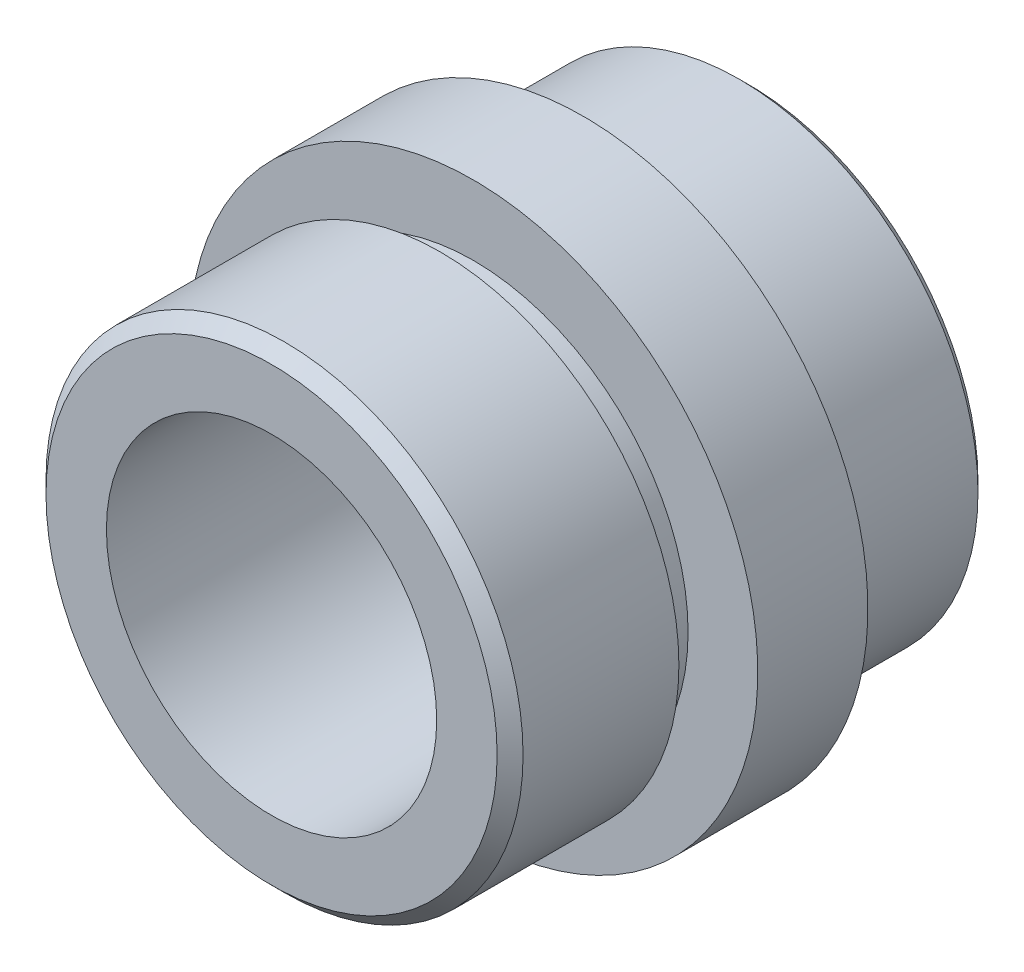
ISO-10303-21;
HEADER;
FILE_DESCRIPTION(('STEP AP214'),'2;1');
FILE_NAME('part.step','',(''),(''),'','','');
FILE_SCHEMA(('AUTOMOTIVE_DESIGN { 1 0 10303 214 1 1 1 1 }'));
ENDSEC;
DATA;
#1=APPLICATION_CONTEXT('core data for automotive mechanical design processes');
#2=APPLICATION_PROTOCOL_DEFINITION('international standard','automotive_design',2000,#1);
#3=PRODUCT_CONTEXT('',#1,'mechanical');
#4=PRODUCT('Part','Part','',(#3));
#5=PRODUCT_RELATED_PRODUCT_CATEGORY('part','',(#4));
#6=PRODUCT_DEFINITION_FORMATION('','',#4);
#7=PRODUCT_DEFINITION_CONTEXT('part definition',#1,'design');
#8=PRODUCT_DEFINITION('design','',#6,#7);
#9=PRODUCT_DEFINITION_SHAPE('','',#8);
#10=(LENGTH_UNIT() NAMED_UNIT(*) SI_UNIT(.MILLI.,.METRE.));
#11=(NAMED_UNIT(*) PLANE_ANGLE_UNIT() SI_UNIT($,.RADIAN.));
#12=(NAMED_UNIT(*) SI_UNIT($,.STERADIAN.) SOLID_ANGLE_UNIT());
#13=UNCERTAINTY_MEASURE_WITH_UNIT(LENGTH_MEASURE(1.E-05),#10,'distance_accuracy_value','');
#14=(GEOMETRIC_REPRESENTATION_CONTEXT(3) GLOBAL_UNCERTAINTY_ASSIGNED_CONTEXT((#13)) GLOBAL_UNIT_ASSIGNED_CONTEXT((#10,
#11,#12)) REPRESENTATION_CONTEXT('',''));
#15=CARTESIAN_POINT('',(0.,0.,0.));
#16=DIRECTION('',(0.,0.,1.));
#17=DIRECTION('',(1.,0.,0.));
#18=AXIS2_PLACEMENT_3D('',#15,#16,#17);
#19=CARTESIAN_POINT('',(0.,0.,26.005));
#20=DIRECTION('',(0.,0.,-1.));
#21=DIRECTION('',(-1.,0.,0.));
#22=AXIS2_PLACEMENT_3D('',#19,#20,#21);
#23=CYLINDRICAL_SURFACE('',#22,11.7);
#24=CARTESIAN_POINT('',(0.,0.,16.8));
#25=DIRECTION('',(0.,0.,-1.));
#26=DIRECTION('',(-1.,0.,0.));
#27=AXIS2_PLACEMENT_3D('',#24,#25,#26);
#28=CIRCLE('',#27,11.7);
#29=CARTESIAN_POINT('',(-11.7,0.,16.8));
#30=VERTEX_POINT('',#29);
#31=EDGE_CURVE('E84',#30,#30,#28,.T.);
#32=ORIENTED_EDGE('',*,*,#31,.T.);
#33=EDGE_LOOP('',(#32));
#34=FACE_BOUND('',#33,.T.);
#35=CARTESIAN_POINT('',(0.,0.,15.));
#36=DIRECTION('',(0.,0.,-1.));
#37=DIRECTION('',(-1.,0.,0.));
#38=AXIS2_PLACEMENT_3D('',#35,#36,#37);
#39=CIRCLE('',#38,11.7);
#40=CARTESIAN_POINT('',(-11.7,0.,15.));
#41=VERTEX_POINT('',#40);
#42=EDGE_CURVE('E10',#41,#41,#39,.T.);
#43=ORIENTED_EDGE('',*,*,#42,.F.);
#44=EDGE_LOOP('',(#43));
#45=FACE_BOUND('',#44,.T.);
#46=ADVANCED_FACE('F35',(#34,#45),#23,.T.);
#47=CARTESIAN_POINT('',(15.5,0.,15.));
#48=DIRECTION('',(0.,0.,1.));
#49=DIRECTION('',(1.,0.,0.));
#50=AXIS2_PLACEMENT_3D('',#47,#48,#49);
#51=PLANE('',#50);
#52=ORIENTED_EDGE('',*,*,#42,.T.);
#53=EDGE_LOOP('',(#52));
#54=FACE_BOUND('',#53,.T.);
#55=CARTESIAN_POINT('',(0.,0.,15.));
#56=DIRECTION('',(0.,0.,-1.));
#57=DIRECTION('',(-1.,0.,0.));
#58=AXIS2_PLACEMENT_3D('',#55,#56,#57);
#59=CIRCLE('',#58,15.5);
#60=CARTESIAN_POINT('',(-15.5,0.,15.));
#61=VERTEX_POINT('',#60);
#62=EDGE_CURVE('E41',#61,#61,#59,.T.);
#63=ORIENTED_EDGE('',*,*,#62,.F.);
#64=EDGE_LOOP('',(#63));
#65=FACE_BOUND('',#64,.T.);
#66=ADVANCED_FACE('F102',(#54,#65),#51,.T.);
#67=CARTESIAN_POINT('',(0.,0.,26.005));
#68=DIRECTION('',(0.,0.,-1.));
#69=DIRECTION('',(-1.,0.,0.));
#70=AXIS2_PLACEMENT_3D('',#67,#68,#69);
#71=CYLINDRICAL_SURFACE('',#70,15.5);
#72=ORIENTED_EDGE('',*,*,#62,.T.);
#73=EDGE_LOOP('',(#72));
#74=FACE_BOUND('',#73,.T.);
#75=CARTESIAN_POINT('',(0.,0.,9.));
#76=DIRECTION('',(0.,0.,-1.));
#77=DIRECTION('',(-1.,0.,0.));
#78=AXIS2_PLACEMENT_3D('',#75,#76,#77);
#79=CIRCLE('',#78,15.5);
#80=CARTESIAN_POINT('',(-15.5,0.,9.));
#81=VERTEX_POINT('',#80);
#82=EDGE_CURVE('E45',#81,#81,#79,.T.);
#83=ORIENTED_EDGE('',*,*,#82,.F.);
#84=EDGE_LOOP('',(#83));
#85=FACE_BOUND('',#84,.T.);
#86=ADVANCED_FACE('F106',(#74,#85),#71,.T.);
#87=CARTESIAN_POINT('',(11.7,0.,9.));
#88=DIRECTION('',(0.,0.,-1.));
#89=DIRECTION('',(-1.,0.,0.));
#90=AXIS2_PLACEMENT_3D('',#87,#88,#89);
#91=PLANE('',#90);
#92=ORIENTED_EDGE('',*,*,#82,.T.);
#93=EDGE_LOOP('',(#92));
#94=FACE_BOUND('',#93,.T.);
#95=CARTESIAN_POINT('',(0.,0.,9.));
#96=DIRECTION('',(0.,0.,-1.));
#97=DIRECTION('',(-1.,0.,0.));
#98=AXIS2_PLACEMENT_3D('',#95,#96,#97);
#99=CIRCLE('',#98,11.7);
#100=CARTESIAN_POINT('',(-11.7,0.,9.));
#101=VERTEX_POINT('',#100);
#102=EDGE_CURVE('E49',#101,#101,#99,.T.);
#103=ORIENTED_EDGE('',*,*,#102,.F.);
#104=EDGE_LOOP('',(#103));
#105=FACE_BOUND('',#104,.T.);
#106=ADVANCED_FACE('F110',(#94,#105),#91,.T.);
#107=CARTESIAN_POINT('',(0.,0.,26.005));
#108=DIRECTION('',(0.,0.,-1.));
#109=DIRECTION('',(-1.,0.,0.));
#110=AXIS2_PLACEMENT_3D('',#107,#108,#109);
#111=CYLINDRICAL_SURFACE('',#110,11.7);
#112=ORIENTED_EDGE('',*,*,#102,.T.);
#113=EDGE_LOOP('',(#112));
#114=FACE_BOUND('',#113,.T.);
#115=CARTESIAN_POINT('',(0.,0.,7.7));
#116=DIRECTION('',(0.,0.,-1.));
#117=DIRECTION('',(-1.,0.,0.));
#118=AXIS2_PLACEMENT_3D('',#115,#116,#117);
#119=CIRCLE('',#118,11.7);
#120=CARTESIAN_POINT('',(-11.7,0.,7.7));
#121=VERTEX_POINT('',#120);
#122=EDGE_CURVE('E54',#121,#121,#119,.T.);
#123=ORIENTED_EDGE('',*,*,#122,.F.);
#124=EDGE_LOOP('',(#123));
#125=FACE_BOUND('',#124,.T.);
#126=ADVANCED_FACE('F116',(#114,#125),#111,.T.);
#127=CARTESIAN_POINT('',(13.,0.,7.7));
#128=DIRECTION('',(0.,0.,1.));
#129=DIRECTION('',(1.,0.,0.));
#130=AXIS2_PLACEMENT_3D('',#127,#128,#129);
#131=PLANE('',#130);
#132=ORIENTED_EDGE('',*,*,#122,.T.);
#133=EDGE_LOOP('',(#132));
#134=FACE_BOUND('',#133,.T.);
#135=CARTESIAN_POINT('',(0.,0.,7.7));
#136=DIRECTION('',(0.,0.,-1.));
#137=DIRECTION('',(-1.,0.,0.));
#138=AXIS2_PLACEMENT_3D('',#135,#136,#137);
#139=CIRCLE('',#138,13.);
#140=CARTESIAN_POINT('',(-13.,0.,7.7));
#141=VERTEX_POINT('',#140);
#142=EDGE_CURVE('E57',#141,#141,#139,.T.);
#143=ORIENTED_EDGE('',*,*,#142,.F.);
#144=EDGE_LOOP('',(#143));
#145=FACE_BOUND('',#144,.T.);
#146=ADVANCED_FACE('F120',(#134,#145),#131,.T.);
#147=CARTESIAN_POINT('',(0.,0.,26.005));
#148=DIRECTION('',(0.,0.,-1.));
#149=DIRECTION('',(-1.,0.,0.));
#150=AXIS2_PLACEMENT_3D('',#147,#148,#149);
#151=CYLINDRICAL_SURFACE('',#150,13.);
#152=ORIENTED_EDGE('',*,*,#142,.T.);
#153=EDGE_LOOP('',(#152));
#154=FACE_BOUND('',#153,.T.);
#155=CARTESIAN_POINT('',(0.,0.,0.500000000000004));
#156=DIRECTION('',(0.,0.,-1.));
#157=DIRECTION('',(-1.,0.,0.));
#158=AXIS2_PLACEMENT_3D('',#155,#156,#157);
#159=CIRCLE('',#158,13.);
#160=CARTESIAN_POINT('',(-13.,0.,0.500000000000004));
#161=VERTEX_POINT('',#160);
#162=EDGE_CURVE('E60',#161,#161,#159,.T.);
#163=ORIENTED_EDGE('',*,*,#162,.F.);
#164=EDGE_LOOP('',(#163));
#165=FACE_BOUND('',#164,.T.);
#166=ADVANCED_FACE('F124',(#154,#165),#151,.T.);
#167=CARTESIAN_POINT('',(0.,0.,0.));
#168=DIRECTION('',(0.,0.,1.));
#169=DIRECTION('',(1.,0.,0.));
#170=AXIS2_PLACEMENT_3D('',#167,#168,#169);
#171=CONICAL_SURFACE('',#170,12.5,0.785398163397447);
#172=ORIENTED_EDGE('',*,*,#162,.T.);
#173=EDGE_LOOP('',(#172));
#174=FACE_BOUND('',#173,.T.);
#175=CARTESIAN_POINT('',(0.,0.,0.));
#176=DIRECTION('',(0.,0.,-1.));
#177=DIRECTION('',(-1.,0.,0.));
#178=AXIS2_PLACEMENT_3D('',#175,#176,#177);
#179=CIRCLE('',#178,12.5);
#180=CARTESIAN_POINT('',(-12.5,0.,0.));
#181=VERTEX_POINT('',#180);
#182=EDGE_CURVE('E63',#181,#181,#179,.T.);
#183=ORIENTED_EDGE('',*,*,#182,.F.);
#184=EDGE_LOOP('',(#183));
#185=FACE_BOUND('',#184,.T.);
#186=ADVANCED_FACE('F128',(#174,#185),#171,.T.);
#187=CARTESIAN_POINT('',(10.,0.,0.));
#188=DIRECTION('',(0.,0.,-1.));
#189=DIRECTION('',(-1.,0.,0.));
#190=AXIS2_PLACEMENT_3D('',#187,#188,#189);
#191=PLANE('',#190);
#192=ORIENTED_EDGE('',*,*,#182,.T.);
#193=EDGE_LOOP('',(#192));
#194=FACE_BOUND('',#193,.T.);
#195=CARTESIAN_POINT('',(0.,0.,0.));
#196=DIRECTION('',(0.,0.,-1.));
#197=DIRECTION('',(-1.,0.,0.));
#198=AXIS2_PLACEMENT_3D('',#195,#196,#197);
#199=CIRCLE('',#198,10.);
#200=CARTESIAN_POINT('',(-10.,0.,0.));
#201=VERTEX_POINT('',#200);
#202=EDGE_CURVE('E66',#201,#201,#199,.T.);
#203=ORIENTED_EDGE('',*,*,#202,.F.);
#204=EDGE_LOOP('',(#203));
#205=FACE_BOUND('',#204,.T.);
#206=ADVANCED_FACE('F132',(#194,#205),#191,.T.);
#207=CARTESIAN_POINT('',(0.,0.,1.));
#208=DIRECTION('',(0.,0.,-1.));
#209=DIRECTION('',(-1.,0.,0.));
#210=AXIS2_PLACEMENT_3D('',#207,#208,#209);
#211=CONICAL_SURFACE('',#210,9.,0.785398163397445);
#212=ORIENTED_EDGE('',*,*,#202,.T.);
#213=EDGE_LOOP('',(#212));
#214=FACE_BOUND('',#213,.T.);
#215=CARTESIAN_POINT('',(0.,0.,1.));
#216=DIRECTION('',(0.,0.,-1.));
#217=DIRECTION('',(-1.,0.,0.));
#218=AXIS2_PLACEMENT_3D('',#215,#216,#217);
#219=CIRCLE('',#218,9.);
#220=CARTESIAN_POINT('',(-9.,0.,1.));
#221=VERTEX_POINT('',#220);
#222=EDGE_CURVE('E69',#221,#221,#219,.T.);
#223=ORIENTED_EDGE('',*,*,#222,.F.);
#224=EDGE_LOOP('',(#223));
#225=FACE_BOUND('',#224,.T.);
#226=ADVANCED_FACE('F136',(#214,#225),#211,.F.);
#227=CARTESIAN_POINT('',(0.,0.,26.005));
#228=DIRECTION('',(0.,0.,-1.));
#229=DIRECTION('',(-1.,0.,0.));
#230=AXIS2_PLACEMENT_3D('',#227,#228,#229);
#231=CYLINDRICAL_SURFACE('',#230,9.);
#232=ORIENTED_EDGE('',*,*,#222,.T.);
#233=EDGE_LOOP('',(#232));
#234=FACE_BOUND('',#233,.T.);
#235=CARTESIAN_POINT('',(0.,0.,26.));
#236=DIRECTION('',(0.,0.,-1.));
#237=DIRECTION('',(-1.,0.,0.));
#238=AXIS2_PLACEMENT_3D('',#235,#236,#237);
#239=CIRCLE('',#238,9.);
#240=CARTESIAN_POINT('',(-9.,0.,26.));
#241=VERTEX_POINT('',#240);
#242=EDGE_CURVE('E72',#241,#241,#239,.T.);
#243=ORIENTED_EDGE('',*,*,#242,.F.);
#244=EDGE_LOOP('',(#243));
#245=FACE_BOUND('',#244,.T.);
#246=ADVANCED_FACE('F140',(#234,#245),#231,.F.);
#247=CARTESIAN_POINT('',(12.292893218813,0.,26.));
#248=DIRECTION('',(0.,0.,1.));
#249=DIRECTION('',(1.,0.,0.));
#250=AXIS2_PLACEMENT_3D('',#247,#248,#249);
#251=PLANE('',#250);
#252=ORIENTED_EDGE('',*,*,#242,.T.);
#253=EDGE_LOOP('',(#252));
#254=FACE_BOUND('',#253,.T.);
#255=CARTESIAN_POINT('',(0.,0.,26.));
#256=DIRECTION('',(0.,0.,-1.));
#257=DIRECTION('',(-1.,0.,0.));
#258=AXIS2_PLACEMENT_3D('',#255,#256,#257);
#259=CIRCLE('',#258,12.292893218813);
#260=CARTESIAN_POINT('',(-12.292893218813,0.,26.));
#261=VERTEX_POINT('',#260);
#262=EDGE_CURVE('E75',#261,#261,#259,.T.);
#263=ORIENTED_EDGE('',*,*,#262,.F.);
#264=EDGE_LOOP('',(#263));
#265=FACE_BOUND('',#264,.T.);
#266=ADVANCED_FACE('F144',(#254,#265),#251,.T.);
#267=CARTESIAN_POINT('',(0.,0.,25.292893218813));
#268=DIRECTION('',(0.,0.,-1.));
#269=DIRECTION('',(-1.,0.,0.));
#270=AXIS2_PLACEMENT_3D('',#267,#268,#269);
#271=CONICAL_SURFACE('',#270,13.,0.785398163397447);
#272=ORIENTED_EDGE('',*,*,#262,.T.);
#273=EDGE_LOOP('',(#272));
#274=FACE_BOUND('',#273,.T.);
#275=CARTESIAN_POINT('',(0.,0.,25.292893218813));
#276=DIRECTION('',(0.,0.,-1.));
#277=DIRECTION('',(-1.,0.,0.));
#278=AXIS2_PLACEMENT_3D('',#275,#276,#277);
#279=CIRCLE('',#278,13.);
#280=CARTESIAN_POINT('',(-13.,0.,25.292893218813));
#281=VERTEX_POINT('',#280);
#282=EDGE_CURVE('E78',#281,#281,#279,.T.);
#283=ORIENTED_EDGE('',*,*,#282,.F.);
#284=EDGE_LOOP('',(#283));
#285=FACE_BOUND('',#284,.T.);
#286=ADVANCED_FACE('F98',(#274,#285),#271,.T.);
#287=CARTESIAN_POINT('',(0.,0.,26.005));
#288=DIRECTION('',(0.,0.,-1.));
#289=DIRECTION('',(-1.,0.,0.));
#290=AXIS2_PLACEMENT_3D('',#287,#288,#289);
#291=CYLINDRICAL_SURFACE('',#290,13.);
#292=ORIENTED_EDGE('',*,*,#282,.T.);
#293=EDGE_LOOP('',(#292));
#294=FACE_BOUND('',#293,.T.);
#295=CARTESIAN_POINT('',(0.,0.,16.8));
#296=DIRECTION('',(0.,0.,-1.));
#297=DIRECTION('',(-1.,0.,0.));
#298=AXIS2_PLACEMENT_3D('',#295,#296,#297);
#299=CIRCLE('',#298,13.);
#300=CARTESIAN_POINT('',(-13.,0.,16.8));
#301=VERTEX_POINT('',#300);
#302=EDGE_CURVE('E81',#301,#301,#299,.T.);
#303=ORIENTED_EDGE('',*,*,#302,.F.);
#304=EDGE_LOOP('',(#303));
#305=FACE_BOUND('',#304,.T.);
#306=ADVANCED_FACE('F92',(#294,#305),#291,.T.);
#307=CARTESIAN_POINT('',(11.7,0.,16.8));
#308=DIRECTION('',(0.,0.,-1.));
#309=DIRECTION('',(-1.,0.,0.));
#310=AXIS2_PLACEMENT_3D('',#307,#308,#309);
#311=PLANE('',#310);
#312=ORIENTED_EDGE('',*,*,#302,.T.);
#313=EDGE_LOOP('',(#312));
#314=FACE_BOUND('',#313,.T.);
#315=ORIENTED_EDGE('',*,*,#31,.F.);
#316=EDGE_LOOP('',(#315));
#317=FACE_BOUND('',#316,.T.);
#318=ADVANCED_FACE('F90',(#314,#317),#311,.T.);
#319=CLOSED_SHELL('',(#46,#66,#86,#106,#126,#146,#166,#186,#206,#226,#246,#266,#286,#306,#318));
#320=MANIFOLD_SOLID_BREP('B2',#319);
#321=ADVANCED_BREP_SHAPE_REPRESENTATION('',(#18,#320),#14);
#322=SHAPE_DEFINITION_REPRESENTATION(#9,#321);
ENDSEC;
END-ISO-10303-21;
